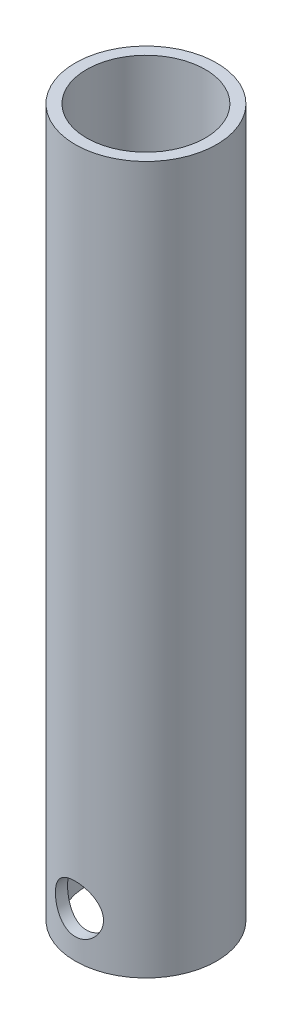
ISO-10303-21;
HEADER;
FILE_DESCRIPTION(('STEP AP214'),'2;1');
FILE_NAME('part.step','',(''),(''),'','','');
FILE_SCHEMA(('AUTOMOTIVE_DESIGN { 1 0 10303 214 1 1 1 1 }'));
ENDSEC;
DATA;
#1=APPLICATION_CONTEXT('core data for automotive mechanical design processes');
#2=APPLICATION_PROTOCOL_DEFINITION('international standard','automotive_design',2000,#1);
#3=PRODUCT_CONTEXT('',#1,'mechanical');
#4=PRODUCT('Part','Part','',(#3));
#5=PRODUCT_RELATED_PRODUCT_CATEGORY('part','',(#4));
#6=PRODUCT_DEFINITION_FORMATION('','',#4);
#7=PRODUCT_DEFINITION_CONTEXT('part definition',#1,'design');
#8=PRODUCT_DEFINITION('design','',#6,#7);
#9=PRODUCT_DEFINITION_SHAPE('','',#8);
#10=(LENGTH_UNIT() NAMED_UNIT(*) SI_UNIT(.MILLI.,.METRE.));
#11=(NAMED_UNIT(*) PLANE_ANGLE_UNIT() SI_UNIT($,.RADIAN.));
#12=(NAMED_UNIT(*) SI_UNIT($,.STERADIAN.) SOLID_ANGLE_UNIT());
#13=UNCERTAINTY_MEASURE_WITH_UNIT(LENGTH_MEASURE(1.E-05),#10,'distance_accuracy_value','');
#14=(GEOMETRIC_REPRESENTATION_CONTEXT(3) GLOBAL_UNCERTAINTY_ASSIGNED_CONTEXT((#13)) GLOBAL_UNIT_ASSIGNED_CONTEXT((#10,
#11,#12)) REPRESENTATION_CONTEXT('',''));
#15=CARTESIAN_POINT('',(0.,0.,0.));
#16=DIRECTION('',(0.,0.,1.));
#17=DIRECTION('',(1.,0.,0.));
#18=AXIS2_PLACEMENT_3D('',#15,#16,#17);
#19=CARTESIAN_POINT('',(0.,125.,0.));
#20=DIRECTION('',(0.,1.,0.));
#21=DIRECTION('',(0.,0.,1.));
#22=AXIS2_PLACEMENT_3D('',#19,#20,#21);
#23=PLANE('',#22);
#24=CARTESIAN_POINT('',(0.,125.,0.));
#25=DIRECTION('',(0.,1.,0.));
#26=DIRECTION('',(0.,0.,1.));
#27=AXIS2_PLACEMENT_3D('',#24,#25,#26);
#28=CIRCLE('',#27,12.5);
#29=CARTESIAN_POINT('',(0.,125.,12.5));
#30=VERTEX_POINT('',#29);
#31=EDGE_CURVE('E10',#30,#30,#28,.T.);
#32=ORIENTED_EDGE('',*,*,#31,.T.);
#33=EDGE_LOOP('',(#32));
#34=FACE_BOUND('',#33,.T.);
#35=CARTESIAN_POINT('',(0.,125.,0.));
#36=DIRECTION('',(0.,1.,0.));
#37=DIRECTION('',(0.,0.,1.));
#38=AXIS2_PLACEMENT_3D('',#35,#36,#37);
#39=CIRCLE('',#38,10.5);
#40=CARTESIAN_POINT('',(0.,125.,10.5));
#41=VERTEX_POINT('',#40);
#42=EDGE_CURVE('E51',#41,#41,#39,.T.);
#43=ORIENTED_EDGE('',*,*,#42,.F.);
#44=EDGE_LOOP('',(#43));
#45=FACE_BOUND('',#44,.T.);
#46=ADVANCED_FACE('F32',(#34,#45),#23,.T.);
#47=CARTESIAN_POINT('',(0.,0.,0.));
#48=DIRECTION('',(0.,1.,0.));
#49=DIRECTION('',(0.,0.,1.));
#50=AXIS2_PLACEMENT_3D('',#47,#48,#49);
#51=PLANE('',#50);
#52=CARTESIAN_POINT('',(0.,0.,0.));
#53=DIRECTION('',(0.,1.,0.));
#54=DIRECTION('',(0.,0.,1.));
#55=AXIS2_PLACEMENT_3D('',#52,#53,#54);
#56=CIRCLE('',#55,12.5);
#57=CARTESIAN_POINT('',(0.,0.,12.5));
#58=VERTEX_POINT('',#57);
#59=EDGE_CURVE('E46',#58,#58,#56,.T.);
#60=ORIENTED_EDGE('',*,*,#59,.F.);
#61=EDGE_LOOP('',(#60));
#62=FACE_BOUND('',#61,.T.);
#63=CARTESIAN_POINT('',(0.,0.,0.));
#64=DIRECTION('',(0.,1.,0.));
#65=DIRECTION('',(0.,0.,1.));
#66=AXIS2_PLACEMENT_3D('',#63,#64,#65);
#67=CIRCLE('',#66,10.5);
#68=CARTESIAN_POINT('',(0.,0.,10.5));
#69=VERTEX_POINT('',#68);
#70=EDGE_CURVE('E54',#69,#69,#67,.T.);
#71=ORIENTED_EDGE('',*,*,#70,.T.);
#72=EDGE_LOOP('',(#71));
#73=FACE_BOUND('',#72,.T.);
#74=ADVANCED_FACE('F103',(#62,#73),#51,.F.);
#75=CARTESIAN_POINT('',(0.,125.,0.));
#76=DIRECTION('',(0.,-1.,0.));
#77=DIRECTION('',(0.,0.,-1.));
#78=AXIS2_PLACEMENT_3D('',#75,#76,#77);
#79=CYLINDRICAL_SURFACE('',#78,12.5);
#80=CARTESIAN_POINT('',(-12.4899959967968,56.,-0.5));
#81=CARTESIAN_POINT('',(-12.4899961315224,56.0280731633728,-0.499998758798746));
#82=CARTESIAN_POINT('',(-12.4900916618139,56.0561663964834,-0.497627754285822));
#83=CARTESIAN_POINT('',(-12.4904635421187,56.111578333317,-0.488202712247755));
#84=CARTESIAN_POINT('',(-12.4907401068309,56.1388960771565,-0.481143114107626));
#85=CARTESIAN_POINT('',(-12.4914426775378,56.1919462896622,-0.462542918883273));
#86=CARTESIAN_POINT('',(-12.4918686090698,56.2176795407324,-0.451004554257527));
#87=CARTESIAN_POINT('',(-12.4928218248314,56.2668367926558,-0.423777660159963));
#88=CARTESIAN_POINT('',(-12.4933490846693,56.2902613472097,-0.408090129134242));
#89=CARTESIAN_POINT('',(-12.4944459704595,56.3341597593796,-0.372997754449343));
#90=CARTESIAN_POINT('',(-12.4950156218316,56.3546318245942,-0.353590669226714));
#91=CARTESIAN_POINT('',(-12.4961328567103,56.3920289255691,-0.311614354933472));
#92=CARTESIAN_POINT('',(-12.4966804393279,56.4089538185401,-0.28904499862844));
#93=CARTESIAN_POINT('',(-12.4976919893825,56.43878028225,-0.241376432340122));
#94=CARTESIAN_POINT('',(-12.4981559302703,56.4516805764639,-0.216276423015974));
#95=CARTESIAN_POINT('',(-12.4989476710099,56.4730834220647,-0.164264700944852));
#96=CARTESIAN_POINT('',(-12.4992754716193,56.4815859979237,-0.137352998280412));
#97=CARTESIAN_POINT('',(-12.4997578274104,56.4939476435077,-0.0824972113326908));
#98=CARTESIAN_POINT('',(-12.4999124760636,56.4978092186378,-0.0545536924725181));
#99=CARTESIAN_POINT('',(-12.5000314109699,56.5007869734338,0.00158535117207156));
#100=CARTESIAN_POINT('',(-12.4999956983058,56.4999031800914,0.0297808745221726));
#101=CARTESIAN_POINT('',(-12.4997380149168,56.4934173785891,0.0856065942701087));
#102=CARTESIAN_POINT('',(-12.4995161507575,56.4878180698984,0.113237104850637));
#103=CARTESIAN_POINT('',(-12.4989112854575,56.4720643622813,0.167165670443885));
#104=CARTESIAN_POINT('',(-12.4985282838213,56.4619099493462,0.193463721358534));
#105=CARTESIAN_POINT('',(-12.4976441157177,56.437331190201,0.243989559590985));
#106=CARTESIAN_POINT('',(-12.4971429151084,56.4229056099518,0.268216745977472));
#107=CARTESIAN_POINT('',(-12.4960788152025,56.3901949127874,0.313906557044649));
#108=CARTESIAN_POINT('',(-12.4955159156358,56.3719097789825,0.335369169626786));
#109=CARTESIAN_POINT('',(-12.4943913691821,56.3319837517768,0.374936326435153));
#110=CARTESIAN_POINT('',(-12.4938297234487,56.3103405165538,0.39303850771634));
#111=CARTESIAN_POINT('',(-12.492771400904,56.2643209026412,0.425352751577672));
#112=CARTESIAN_POINT('',(-12.4922747241059,56.2399445233982,0.439564813370343));
#113=CARTESIAN_POINT('',(-12.4914023756991,56.1891492044641,0.463695156244902));
#114=CARTESIAN_POINT('',(-12.491026706401,56.1627302257815,0.47361335533723));
#115=CARTESIAN_POINT('',(-12.490438827807,56.1086002658312,0.488872885770282));
#116=CARTESIAN_POINT('',(-12.4902266177232,56.0808892907914,0.494214239170918));
#117=CARTESIAN_POINT('',(-12.4899897312153,56.024982520474,0.500165547407391));
#118=CARTESIAN_POINT('',(-12.4899649249297,55.9967870744922,0.500778778601814));
#119=CARTESIAN_POINT('',(-12.490105304363,55.9406936552421,0.497264978377538));
#120=CARTESIAN_POINT('',(-12.4902704896835,55.91279568135,0.493137956901042));
#121=CARTESIAN_POINT('',(-12.4907721140578,55.858098295749,0.480263517491171));
#122=CARTESIAN_POINT('',(-12.4911084977489,55.8312985319235,0.471517593196318));
#123=CARTESIAN_POINT('',(-12.4919145543835,55.7795474852272,0.449655125479497));
#124=CARTESIAN_POINT('',(-12.4923842278159,55.7545962091386,0.4365385660223));
#125=CARTESIAN_POINT('',(-12.4934042386814,55.7072353286888,0.406298729404587));
#126=CARTESIAN_POINT('',(-12.4939546204274,55.6848271326692,0.389173248050535));
#127=CARTESIAN_POINT('',(-12.4950738514507,55.6432026539284,0.351404926283493));
#128=CARTESIAN_POINT('',(-12.4956427008063,55.6239863847076,0.33076207099436));
#129=CARTESIAN_POINT('',(-12.4967351243546,55.5892802699084,0.286530925488431));
#130=CARTESIAN_POINT('',(-12.4972586727539,55.5737925384553,0.262940975693575));
#131=CARTESIAN_POINT('',(-12.4982011149901,55.5469975887314,0.213493699311905));
#132=CARTESIAN_POINT('',(-12.4986200091592,55.5356903571848,0.187636379925756));
#133=CARTESIAN_POINT('',(-12.4993058040844,55.5175810839965,0.134396283000124));
#134=CARTESIAN_POINT('',(-12.4995727507864,55.5107776803824,0.10701396934191));
#135=CARTESIAN_POINT('',(-12.4999247446076,55.501864723718,0.0514946355329766));
#136=CARTESIAN_POINT('',(-12.5000097922652,55.4997551567742,0.0233576176163788));
#137=CARTESIAN_POINT('',(-12.4999884051138,55.5002899097484,-0.0328513731026747));
#138=CARTESIAN_POINT('',(-12.4998821041397,55.5029309069794,-0.0609233776279531));
#139=CARTESIAN_POINT('',(-12.4994902558297,55.5128849677852,-0.116225169175835));
#140=CARTESIAN_POINT('',(-12.4992047081453,55.5201980404413,-0.143454954561276));
#141=CARTESIAN_POINT('',(-12.4984865131084,55.5392880611364,-0.19630026155011));
#142=CARTESIAN_POINT('',(-12.4980538637642,55.5510650696124,-0.221915761292292));
#143=CARTESIAN_POINT('',(-12.4970901740698,55.5787478977871,-0.270805791204831));
#144=CARTESIAN_POINT('',(-12.496559137042,55.594653578073,-0.294080400383137));
#145=CARTESIAN_POINT('',(-12.4954580704139,55.6301534802439,-0.337644146779991));
#146=CARTESIAN_POINT('',(-12.4948880179186,55.6497498799467,-0.357931508626451));
#147=CARTESIAN_POINT('',(-12.4937732712101,55.6920761140362,-0.39493433452815));
#148=CARTESIAN_POINT('',(-12.4932285832932,55.7148067209179,-0.411648915393999));
#149=CARTESIAN_POINT('',(-12.4922257291581,55.7627689311172,-0.441036725205956));
#150=CARTESIAN_POINT('',(-12.4917676310666,55.78800248008,-0.453706777379506));
#151=CARTESIAN_POINT('',(-12.4909907754811,55.8402212443404,-0.474615582615988));
#152=CARTESIAN_POINT('',(-12.4906718525999,55.867204336529,-0.482859598009789));
#153=CARTESIAN_POINT('',(-12.4902942095784,55.9119638886124,-0.492507314414765));
#154=CARTESIAN_POINT('',(-12.4901828688378,55.9294500810227,-0.495313513479018));
#155=CARTESIAN_POINT('',(-12.490033720011,55.9646215249919,-0.499060246908735));
#156=CARTESIAN_POINT('',(-12.4899959118854,55.9823067764443,-0.500000782272058));
#157=CARTESIAN_POINT('',(-12.4899959967968,56.,-0.5));
#158=B_SPLINE_CURVE_WITH_KNOTS('',3,(#80,#81,#82,#83,#84,#85,#86,#87,#88,#89,#90,#91,#92,#93,
#94,#95,#96,#97,#98,#99,#100,#101,#102,#103,#104,#105,#106,#107,#108,#109,#110,#111,#112,#113,
#114,#115,#116,#117,#118,#119,#120,#121,#122,#123,#124,#125,#126,#127,#128,#129,#130,#131,#132,
#133,#134,#135,#136,#137,#138,#139,#140,#141,#142,#143,#144,#145,#146,#147,#148,#149,#150,#151,
#152,#153,#154,#155,#156,#157),.UNSPECIFIED.,.T.,.F.,(4,2,2,2,2,2,2,2,2,2,2,2,2,2,2,2,2,2,2,2,2,
2,2,2,2,2,2,2,2,2,2,2,2,2,2,2,2,2,4),(0.,0.0841549055975104,0.168409796543891,0.252622744132724,
0.336815445315113,0.42105904509454,0.505306035400837,0.589579720121223,0.673852935875886,
0.758080636981668,0.842307858999569,0.92648689659987,1.01066619308291,1.09486983468678,
1.17907384477696,1.26333684192478,1.34759985612988,1.43186447923196,1.51612869618518,
1.60033451688446,1.68454016097082,1.76871859170033,1.85289733127175,1.93712246332911,
2.02134795161137,2.10562108485664,2.18989395047879,2.27414132005546,2.35838844026539,
2.44257665842244,2.52676504021994,2.6109545618805,2.69514124108647,2.77937775365914,
2.86363506542886,2.94795839513712,3.03218124544945,3.08522023983212,3.13825920584661),.UNSPECIFIED.);
#159=CARTESIAN_POINT('',(-12.4899959967968,56.,-0.5));
#160=VERTEX_POINT('',#159);
#161=EDGE_CURVE('E64',#160,#160,#158,.T.);
#162=ORIENTED_EDGE('',*,*,#161,.T.);
#163=EDGE_LOOP('',(#162));
#164=FACE_BOUND('',#163,.T.);
#165=CARTESIAN_POINT('',(0.,12.25,-12.5));
#166=CARTESIAN_POINT('',(-0.231629316585797,12.2500020330341,-12.5000013493631));
#167=CARTESIAN_POINT('',(-0.463244602260156,12.2310026670462,-12.493502868787));
#168=CARTESIAN_POINT('',(-0.919637198733393,12.1557510509299,-12.4682205879803));
#169=CARTESIAN_POINT('',(-1.14441406994913,12.0994964112488,-12.4494359997198));
#170=CARTESIAN_POINT('',(-1.58048439723264,11.9518965380055,-12.4016188733298));
#171=CARTESIAN_POINT('',(-1.79180021823001,11.860611378287,-12.3726038861914));
#172=CARTESIAN_POINT('',(-2.1961203899874,11.6458184811844,-12.3072763657775));
#173=CARTESIAN_POINT('',(-2.38912089291743,11.5223039931499,-12.270962304028));
#174=CARTESIAN_POINT('',(-2.75825261944734,11.2419106918981,-12.1933910285169));
#175=CARTESIAN_POINT('',(-2.93363688121842,11.0840824421219,-12.1520119725704));
#176=CARTESIAN_POINT('',(-3.25602333800846,10.7415597009182,-12.069633438027));
#177=CARTESIAN_POINT('',(-3.40301894005995,10.5568589860642,-12.0286340497037));
#178=CARTESIAN_POINT('',(-3.66879190776174,10.1590227206061,-11.9503048632061));
#179=CARTESIAN_POINT('',(-3.78658554363524,9.94519807052359,-11.9131228611846));
#180=CARTESIAN_POINT('',(-3.98421855180598,9.49930533937396,-11.8484975327096));
#181=CARTESIAN_POINT('',(-4.06407004270031,9.26724311096489,-11.8210510974587));
#182=CARTESIAN_POINT('',(-4.180727158555,8.79997546727208,-11.7802904138908));
#183=CARTESIAN_POINT('',(-4.21893677153849,8.56516186015111,-11.7665167255043));
#184=CARTESIAN_POINT('',(-4.2556150496915,8.09208349333586,-11.7533040945085));
#185=CARTESIAN_POINT('',(-4.25409658909983,7.85381987666286,-11.7538605081001));
#186=CARTESIAN_POINT('',(-4.21244934024964,7.39270505417056,-11.7688435667819));
#187=CARTESIAN_POINT('',(-4.1741694203804,7.16966149615458,-11.7826060062583));
#188=CARTESIAN_POINT('',(-4.06310816523945,6.73337451247597,-11.8213609901718));
#189=CARTESIAN_POINT('',(-3.99032254229152,6.52013230834213,-11.8463549302143));
#190=CARTESIAN_POINT('',(-3.81113653039608,6.10536762878388,-11.9052184288415));
#191=CARTESIAN_POINT('',(-3.70419900732798,5.90409797144144,-11.9392282253861));
#192=CARTESIAN_POINT('',(-3.46011773998614,5.52178292612745,-12.0122344758094));
#193=CARTESIAN_POINT('',(-3.3229649914025,5.34074359119888,-12.0512324147271));
#194=CARTESIAN_POINT('',(-3.01353124215082,4.99366148971603,-12.1324166416207));
#195=CARTESIAN_POINT('',(-2.83974395035441,4.82897235645759,-12.1746609041245));
#196=CARTESIAN_POINT('',(-2.46650176991709,4.53071467225496,-12.2557250188891));
#197=CARTESIAN_POINT('',(-2.26704421977735,4.39714935227699,-12.294544515365));
#198=CARTESIAN_POINT('',(-1.84516436753421,4.16378172002493,-12.3649312356261));
#199=CARTESIAN_POINT('',(-1.62251944687187,4.06435543822436,-12.3964165316577));
#200=CARTESIAN_POINT('',(-1.16233553494295,3.90479262891258,-12.4479909440337));
#201=CARTESIAN_POINT('',(-0.924801969927404,3.84464187741783,-12.4680841857644));
#202=CARTESIAN_POINT('',(-0.453032806948609,3.76776665202227,-12.4939206883818));
#203=CARTESIAN_POINT('',(-0.219127772365223,3.74921408351853,-12.5002675966187));
#204=CARTESIAN_POINT('',(0.248508234272232,3.7508366933351,-12.499715139365));
#205=CARTESIAN_POINT('',(0.482239229767979,3.77100503411456,-12.4928181125577));
#206=CARTESIAN_POINT('',(0.935487055917021,3.84805823396341,-12.4669514589193));
#207=CARTESIAN_POINT('',(1.15521999196989,3.9038095457653,-12.4483547937561));
#208=CARTESIAN_POINT('',(1.58211571473706,4.04901745782596,-12.4013331971436));
#209=CARTESIAN_POINT('',(1.78927688332144,4.13847838625904,-12.3729070036624));
#210=CARTESIAN_POINT('',(2.19135854363443,4.3512234537794,-12.3081499547371));
#211=CARTESIAN_POINT('',(2.3858005114391,4.47535189063502,-12.2716272117682));
#212=CARTESIAN_POINT('',(2.75168306551547,4.75292288478746,-12.1948041286534));
#213=CARTESIAN_POINT('',(2.92311635003781,4.90637471052051,-12.1545025961777));
#214=CARTESIAN_POINT('',(3.24657351287904,5.2468275664985,-12.0722386132383));
#215=CARTESIAN_POINT('',(3.39729328842666,5.435073487899,-12.0302879182072));
#216=CARTESIAN_POINT('',(3.66518020873975,5.83507787799934,-11.9514023496921));
#217=CARTESIAN_POINT('',(3.78234674334563,6.0468367741812,-11.914467567428));
#218=CARTESIAN_POINT('',(3.97933669538634,6.48815668029807,-11.8501336294714));
#219=CARTESIAN_POINT('',(4.05920753889126,6.71769464628497,-11.8227223748612));
#220=CARTESIAN_POINT('',(4.17877629044749,7.18811756728479,-11.7809981443993));
#221=CARTESIAN_POINT('',(4.21849327320324,7.42899707763657,-11.7666789496003));
#222=CARTESIAN_POINT('',(4.2551029021973,7.90142527017271,-11.7534862510052));
#223=CARTESIAN_POINT('',(4.2541688433069,8.13278545064399,-11.7538288765012));
#224=CARTESIAN_POINT('',(4.21488538095235,8.59186656764045,-11.7679720866019));
#225=CARTESIAN_POINT('',(4.17653837981658,8.81958773687654,-11.781771807111));
#226=CARTESIAN_POINT('',(4.06508169516974,9.26024866991023,-11.8206793925214));
#227=CARTESIAN_POINT('',(3.99270334550051,9.47339613866282,-11.8455487968498));
#228=CARTESIAN_POINT('',(3.81583792726954,9.88468116899619,-11.9036971533386));
#229=CARTESIAN_POINT('',(3.71134355482286,10.0828153034268,-11.9369780181425));
#230=CARTESIAN_POINT('',(3.46772073523882,10.4681337048613,-12.0100690469571));
#231=CARTESIAN_POINT('',(3.32724348872325,10.6544218744554,-12.0501058971147));
#232=CARTESIAN_POINT('',(3.01789256015419,11.0014819910172,-12.1312763731794));
#233=CARTESIAN_POINT('',(2.84901069833453,11.162246561876,-12.1724103121393));
#234=CARTESIAN_POINT('',(2.4793015879225,11.4603796450803,-12.2531734329683));
#235=CARTESIAN_POINT('',(2.2774454476222,11.5965125530158,-12.2926709568964));
#236=CARTESIAN_POINT('',(1.85239769842135,11.8327805226005,-12.3638575017702));
#237=CARTESIAN_POINT('',(1.62921053671336,11.9329230670564,-12.3955481454238));
#238=CARTESIAN_POINT('',(1.1749855410373,12.0911995465962,-12.4466848305204));
#239=CARTESIAN_POINT('',(0.944413374480445,12.1505523489214,-12.4664836857426));
#240=CARTESIAN_POINT('',(0.475887689244039,12.2299455427374,-12.4931386057906));
#241=CARTESIAN_POINT('',(0.237936441911583,12.2499979116076,-12.4999986138946));
#242=CARTESIAN_POINT('',(0.,12.25,-12.5));
#243=B_SPLINE_CURVE_WITH_KNOTS('',3,(#165,#166,#167,#168,#169,#170,#171,#172,#173,#174,#175,
#176,#177,#178,#179,#180,#181,#182,#183,#184,#185,#186,#187,#188,#189,#190,#191,#192,#193,#194,
#195,#196,#197,#198,#199,#200,#201,#202,#203,#204,#205,#206,#207,#208,#209,#210,#211,#212,#213,
#214,#215,#216,#217,#218,#219,#220,#221,#222,#223,#224,#225,#226,#227,#228,#229,#230,#231,#232,
#233,#234,#235,#236,#237,#238,#239,#240,#241,#242),.UNSPECIFIED.,.T.,.F.,(4,2,2,2,2,2,2,2,2,2,2,
2,2,2,2,2,2,2,2,2,2,2,2,2,2,2,2,2,2,2,2,2,2,2,2,2,2,2,4),(0.,0.694012031135521,1.38806858050573,
2.08094017307814,2.77395700894338,3.48937549744916,4.20495993509719,4.94210626785764,
5.67901699996315,6.39023024980915,7.10121302747361,7.77821403353031,8.45529918574264,
9.14360628251112,9.83211877686468,10.5581272082641,11.2842109731308,12.0180534127162,
12.7516299370932,13.4522781499046,14.1528026499667,14.8320547208526,15.5113940346079,
16.2089885679879,16.9068039604598,17.6376748123878,18.368558954226,19.0985111385898,
19.8281164030437,20.5187658396099,21.2093709316938,21.8857695188883,22.5623220478608,
23.2693695244284,23.976620961389,24.7129879656022,25.4492017820333,26.1623287080454,
26.8752382644273),.UNSPECIFIED.);
#244=CARTESIAN_POINT('',(0.,12.25,-12.5));
#245=VERTEX_POINT('',#244);
#246=EDGE_CURVE('E89',#245,#245,#243,.T.);
#247=ORIENTED_EDGE('',*,*,#246,.T.);
#248=EDGE_LOOP('',(#247));
#249=FACE_BOUND('',#248,.T.);
#250=CARTESIAN_POINT('',(4.25,8.,11.7553179455087));
#251=CARTESIAN_POINT('',(4.25000208635938,7.76880822439578,11.7553163048564));
#252=CARTESIAN_POINT('',(4.23107177309128,7.53763061110169,11.7622127031611));
#253=CARTESIAN_POINT('',(4.15611937649357,7.08214309436849,11.7889024426549));
#254=CARTESIAN_POINT('',(4.10009241001671,6.85783409913431,11.8086974817267));
#255=CARTESIAN_POINT('',(3.95315727615972,6.42275978860879,11.8586887228588));
#256=CARTESIAN_POINT('',(3.86231972243053,6.21196805734828,11.8888638561852));
#257=CARTESIAN_POINT('',(3.64858465717113,5.80854511457881,11.9561841704273));
#258=CARTESIAN_POINT('',(3.52567963418154,5.6159181723876,11.9933309838111));
#259=CARTESIAN_POINT('',(3.24593667986677,5.24644783865442,12.0721055733369));
#260=CARTESIAN_POINT('',(3.08801191357713,5.07045163008639,12.1138482614208));
#261=CARTESIAN_POINT('',(2.74502977872382,4.74686087824586,12.1961419607755));
#262=CARTESIAN_POINT('',(2.55996786105974,4.59927110646021,12.2366927708767));
#263=CARTESIAN_POINT('',(2.16173358215593,4.33280306385099,12.3133695834904));
#264=CARTESIAN_POINT('',(1.9479322684075,4.2148175164114,12.3493447648353));
#265=CARTESIAN_POINT('',(1.50208314069309,4.01682398888647,12.4114588114545));
#266=CARTESIAN_POINT('',(1.27004047751297,3.93680533272072,12.4376004414402));
#267=CARTESIAN_POINT('',(0.803181808925198,3.819904815012,12.4762877361144));
#268=CARTESIAN_POINT('',(0.568768024092831,3.78157056541103,12.4892899687544));
#269=CARTESIAN_POINT('',(0.096498681332753,3.74450353045823,12.5018568685094));
#270=CARTESIAN_POINT('',(-0.141355937364764,3.74576013468428,12.5014251359524));
#271=CARTESIAN_POINT('',(-0.603455244429958,3.78692937785992,12.4874792686763));
#272=CARTESIAN_POINT('',(-0.827859366125013,3.82526336393966,12.474499409838));
#273=CARTESIAN_POINT('',(-1.26683563867679,3.93688176729382,12.4375910854643));
#274=CARTESIAN_POINT('',(-1.48140711554011,4.01016857654574,12.4136618706201));
#275=CARTESIAN_POINT('',(-1.89801640335549,4.19050413003855,12.3568751775078));
#276=CARTESIAN_POINT('',(-2.09984758406958,4.2979923868106,12.3239022889639));
#277=CARTESIAN_POINT('',(-2.48306659203639,4.54331376073188,12.2524460502634));
#278=CARTESIAN_POINT('',(-2.66444855405648,4.68115555055399,12.2139611262977));
#279=CARTESIAN_POINT('',(-3.01099992399037,4.99117453014917,12.1333048225972));
#280=CARTESIAN_POINT('',(-3.17494418986543,5.16470026780617,12.0910451976412));
#281=CARTESIAN_POINT('',(-3.47181232675949,5.53712761234405,12.0091752957356));
#282=CARTESIAN_POINT('',(-3.60473100646118,5.73603345732031,11.969565462949));
#283=CARTESIAN_POINT('',(-3.83756473071074,6.15759992871054,11.8969851778806));
#284=CARTESIAN_POINT('',(-3.93694148373781,6.38057849899919,11.8641260508176));
#285=CARTESIAN_POINT('',(-4.09631339640205,6.84150572085196,11.8100543141711));
#286=CARTESIAN_POINT('',(-4.15632586418345,7.07944774261142,11.7888365866345));
#287=CARTESIAN_POINT('',(-4.23272709729825,7.55164009628404,11.7616154920121));
#288=CARTESIAN_POINT('',(-4.25102291540232,7.78554356028312,11.7549476419358));
#289=CARTESIAN_POINT('',(-4.2488891326801,8.25312404522198,11.7557200468072));
#290=CARTESIAN_POINT('',(-4.22846693505826,8.48680110090525,11.7631576046845));
#291=CARTESIAN_POINT('',(-4.15119312232908,8.93845888046283,11.790638359865));
#292=CARTESIAN_POINT('',(-4.09568855042672,9.15670154188792,11.8102149538794));
#293=CARTESIAN_POINT('',(-3.9514537893724,9.58072428752929,11.8592485003546));
#294=CARTESIAN_POINT('',(-3.86271756175014,9.78650209887829,11.888707248384));
#295=CARTESIAN_POINT('',(-3.65124748009679,10.1872093806727,11.9553766913527));
#296=CARTESIAN_POINT('',(-3.52749746510955,10.3815646574045,11.9928092351957));
#297=CARTESIAN_POINT('',(-3.25065304738288,10.7474387202912,12.0707872460142));
#298=CARTESIAN_POINT('',(-3.09754966045709,10.9189504874256,12.1113336637695));
#299=CARTESIAN_POINT('',(-2.75718975144257,11.2432047947156,12.1934414759765));
#300=CARTESIAN_POINT('',(-2.56860120561712,11.3945664440502,12.2349510943746));
#301=CARTESIAN_POINT('',(-2.16767839127811,11.6635958933644,12.3123024299383));
#302=CARTESIAN_POINT('',(-1.9553448608948,11.7812647403048,12.3481443232058));
#303=CARTESIAN_POINT('',(-1.51390748124952,11.9785220351902,12.4099713333259));
#304=CARTESIAN_POINT('',(-1.28491760269165,12.0583455126643,12.4360170721838));
#305=CARTESIAN_POINT('',(-0.815699002397318,12.1780013666957,12.4755748071516));
#306=CARTESIAN_POINT('',(-0.575474556193984,12.2178488293486,12.489091531298));
#307=CARTESIAN_POINT('',(-0.103211830111088,12.2550209742181,12.50169717107));
#308=CARTESIAN_POINT('',(0.128654421017075,12.2543244388139,12.501457487594));
#309=CARTESIAN_POINT('',(0.588812496753036,12.2153415064129,12.4882452162174));
#310=CARTESIAN_POINT('',(0.81710462958583,12.177058369155,12.4752737324961));
#311=CARTESIAN_POINT('',(1.25973733436524,12.0653164091026,12.438311718123));
#312=CARTESIAN_POINT('',(1.47424962273104,11.992469689247,12.4145132190251));
#313=CARTESIAN_POINT('',(1.88808156366101,11.8142408217572,12.3583495347409));
#314=CARTESIAN_POINT('',(2.08739842506849,11.7088527146591,12.3259827805629));
#315=CARTESIAN_POINT('',(2.47341490547125,11.4639468867196,12.2544776933187));
#316=CARTESIAN_POINT('',(2.65935109194141,11.3232880355071,12.2151293747917));
#317=CARTESIAN_POINT('',(3.0056225058322,11.0137518219909,12.1345744052391));
#318=CARTESIAN_POINT('',(3.16594936631593,10.8448652740194,12.0933671524889));
#319=CARTESIAN_POINT('',(3.46317770167239,10.4753569274188,12.0117094140378));
#320=CARTESIAN_POINT('',(3.59884229876753,10.2737145025818,11.9713600094017));
#321=CARTESIAN_POINT('',(3.83428262236865,9.84922788369567,11.8980483180312));
#322=CARTESIAN_POINT('',(3.93406590564969,9.62638816641279,11.865084476414));
#323=CARTESIAN_POINT('',(4.0917578844551,9.17293560548369,11.8116162303556));
#324=CARTESIAN_POINT('',(4.15089676108841,8.94279496688636,11.7907491035731));
#325=CARTESIAN_POINT('',(4.23000923378121,8.47509598091428,11.7626034107323));
#326=CARTESIAN_POINT('',(4.24999785634726,8.23754051505206,11.7553196312149));
#327=CARTESIAN_POINT('',(4.25,8.,11.7553179455087));
#328=B_SPLINE_CURVE_WITH_KNOTS('',3,(#250,#251,#252,#253,#254,#255,#256,#257,#258,#259,#260,
#261,#262,#263,#264,#265,#266,#267,#268,#269,#270,#271,#272,#273,#274,#275,#276,#277,#278,#279,
#280,#281,#282,#283,#284,#285,#286,#287,#288,#289,#290,#291,#292,#293,#294,#295,#296,#297,#298,
#299,#300,#301,#302,#303,#304,#305,#306,#307,#308,#309,#310,#311,#312,#313,#314,#315,#316,#317,
#318,#319,#320,#321,#322,#323,#324,#325,#326,#327),.UNSPECIFIED.,.T.,.F.,(4,2,2,2,2,2,2,2,2,2,2,
2,2,2,2,2,2,2,2,2,2,2,2,2,2,2,2,2,2,2,2,2,2,2,2,2,2,2,4),(0.,0.692694920384617,1.38548104047712,
2.07686921235574,2.76841948009047,3.48554525708903,4.20279138623515,4.93959691860359,
5.67619514235265,6.38621339082408,7.09604135470939,7.77691942027095,8.45784408804076,
9.14789875658826,9.83815084536889,10.5621283168264,11.2862268402086,12.0214474433795,
12.7563445591683,13.456908323454,14.1573381476704,14.8323840278356,15.5075526290563,
16.2047830406201,16.9022271951569,17.6348081128836,18.3673662641226,19.0953134364971,
19.8229857936747,20.515174766614,21.2073037140138,21.8876085563469,22.568038060209,
23.2742297793021,23.9806517515895,24.7161707244756,25.4515347027242,26.1635249917672,
26.8752419537226),.UNSPECIFIED.);
#329=CARTESIAN_POINT('',(4.25,8.,11.7553179455087));
#330=VERTEX_POINT('',#329);
#331=EDGE_CURVE('E83',#330,#330,#328,.T.);
#332=ORIENTED_EDGE('',*,*,#331,.T.);
#333=EDGE_LOOP('',(#332));
#334=FACE_BOUND('',#333,.T.);
#335=ORIENTED_EDGE('',*,*,#31,.F.);
#336=EDGE_LOOP('',(#335));
#337=FACE_BOUND('',#336,.T.);
#338=ORIENTED_EDGE('',*,*,#59,.T.);
#339=EDGE_LOOP('',(#338));
#340=FACE_BOUND('',#339,.T.);
#341=ADVANCED_FACE('F34',(#164,#249,#334,#337,#340),#79,.T.);
#342=CARTESIAN_POINT('',(0.,125.,0.));
#343=DIRECTION('',(0.,-1.,0.));
#344=DIRECTION('',(0.,0.,-1.));
#345=AXIS2_PLACEMENT_3D('',#342,#343,#344);
#346=CYLINDRICAL_SURFACE('',#345,10.5);
#347=CARTESIAN_POINT('',(-10.4880884817015,56.,-0.5));
#348=CARTESIAN_POINT('',(-10.4880886418168,56.0280681316031,-0.499998760661433));
#349=CARTESIAN_POINT('',(-10.4882023661847,56.0561562099475,-0.497628602575389));
#350=CARTESIAN_POINT('',(-10.4886450598663,56.1115576338928,-0.488207118868973));
#351=CARTESIAN_POINT('',(-10.4889742832942,56.13887002509,-0.481150266604977));
#352=CARTESIAN_POINT('',(-10.4898105980399,56.191909504748,-0.4625577937577));
#353=CARTESIAN_POINT('',(-10.4903175992042,56.2176373889745,-0.451024442953018));
#354=CARTESIAN_POINT('',(-10.4914522265856,56.2667849699971,-0.423809814554239));
#355=CARTESIAN_POINT('',(-10.4920798241787,56.2902052125272,-0.408129520917576));
#356=CARTESIAN_POINT('',(-10.4933855958008,56.3341015188939,-0.373049783436998));
#357=CARTESIAN_POINT('',(-10.4940638105437,56.354575173017,-0.353647325524974));
#358=CARTESIAN_POINT('',(-10.4953940090744,56.3919766074015,-0.311679991783229));
#359=CARTESIAN_POINT('',(-10.4960459917945,56.4089042434425,-0.289114987391565));
#360=CARTESIAN_POINT('',(-10.4972505565079,56.4387395294913,-0.241450780784619));
#361=CARTESIAN_POINT('',(-10.4978030929216,56.4516453381308,-0.216350424718026));
#362=CARTESIAN_POINT('',(-10.4987460932963,56.4730587924448,-0.164336153580602));
#363=CARTESIAN_POINT('',(-10.4991365584001,56.4815664691275,-0.137422251297343));
#364=CARTESIAN_POINT('',(-10.4997111445915,56.4939358900889,-0.0825667203082614));
#365=CARTESIAN_POINT('',(-10.4998954234781,56.4978011874521,-0.0546258944694464));
#366=CARTESIAN_POINT('',(-10.5000373990613,56.5007870916517,0.00150858244584018));
#367=CARTESIAN_POINT('',(-10.4999950974133,56.4999077331546,0.0297022316735788));
#368=CARTESIAN_POINT('',(-10.4996888121692,56.4934322402437,0.0855179825005012));
#369=CARTESIAN_POINT('',(-10.499425008352,56.4878399310122,0.113140529003074));
#370=CARTESIAN_POINT('',(-10.4987056425946,56.4721032100767,0.167054342249818));
#371=CARTESIAN_POINT('',(-10.4982500799054,56.4619587805952,0.193345603794404));
#372=CARTESIAN_POINT('',(-10.4971982069147,56.4374014164063,0.243862854706495));
#373=CARTESIAN_POINT('',(-10.4966018391159,56.422986737345,0.268087994865942));
#374=CARTESIAN_POINT('',(-10.4953355232872,56.3902993295786,0.313776055706061));
#375=CARTESIAN_POINT('',(-10.4946655747887,56.3720265763034,0.335238958794112));
#376=CARTESIAN_POINT('',(-10.493326766707,56.3321200882274,0.374815599387355));
#377=CARTESIAN_POINT('',(-10.492657908865,56.3104830348549,0.392925990890224));
#378=CARTESIAN_POINT('',(-10.4913973562923,56.2644738073421,0.42525774740509));
#379=CARTESIAN_POINT('',(-10.4908056615807,56.240101632524,0.439479111453473));
#380=CARTESIAN_POINT('',(-10.4897662101838,56.1893119981773,0.463628818845079));
#381=CARTESIAN_POINT('',(-10.4893184576332,56.1628944799257,0.473557038875928));
#382=CARTESIAN_POINT('',(-10.4886175431107,56.1087649578921,0.488836409691078));
#383=CARTESIAN_POINT('',(-10.4883643798112,56.081052962943,0.494187591701945));
#384=CARTESIAN_POINT('',(-10.4880814374807,56.0251502710814,0.50015685256183));
#385=CARTESIAN_POINT('',(-10.4880514393226,55.9969600709961,0.500779574322352));
#386=CARTESIAN_POINT('',(-10.4882176381039,55.9408755715159,0.497286351685609));
#387=CARTESIAN_POINT('',(-10.488413834366,55.9129812712351,0.493170421477281));
#388=CARTESIAN_POINT('',(-10.4890101082581,55.8582934168203,0.480320580964128));
#389=CARTESIAN_POINT('',(-10.4894100921586,55.8314993627589,0.471588793593155));
#390=CARTESIAN_POINT('',(-10.4903687786354,55.7797571917575,0.449757250840562));
#391=CARTESIAN_POINT('',(-10.4909274820435,55.7548090844932,0.436657472565263));
#392=CARTESIAN_POINT('',(-10.4921411684907,55.7074456275445,0.406449878698394));
#393=CARTESIAN_POINT('',(-10.4927962263291,55.6850322696945,0.389338943093966));
#394=CARTESIAN_POINT('',(-10.4941285246177,55.6433945762234,0.351599312576747));
#395=CARTESIAN_POINT('',(-10.4948057651973,55.624170259207,0.330970597142845));
#396=CARTESIAN_POINT('',(-10.4961067355828,55.5894407676476,0.286761046380671));
#397=CARTESIAN_POINT('',(-10.4967304219926,55.5739385913027,0.263177854322722));
#398=CARTESIAN_POINT('',(-10.4978533718814,55.5471139257827,0.213740715538109));
#399=CARTESIAN_POINT('',(-10.4983526358643,55.5357914196819,0.187886778007492));
#400=CARTESIAN_POINT('',(-10.4991702644493,55.5176527453511,0.134653221740582));
#401=CARTESIAN_POINT('',(-10.4994887061787,55.5108346556181,0.107274258964214));
#402=CARTESIAN_POINT('',(-10.4999091074728,55.5018920610619,0.0517586434255556));
#403=CARTESIAN_POINT('',(-10.5000110681088,55.4997675330092,0.0236219944139187));
#404=CARTESIAN_POINT('',(-10.4999870210703,55.5002725950076,-0.032580520178207));
#405=CARTESIAN_POINT('',(-10.4998612390137,55.5028974799548,-0.0606464282594962));
#406=CARTESIAN_POINT('',(-10.4993963125418,55.5128171363664,-0.115938631913234));
#407=CARTESIAN_POINT('',(-10.4990571677209,55.5201119167068,-0.143164925889745));
#408=CARTESIAN_POINT('',(-10.4982036779045,55.5391633524479,-0.196006094063663));
#409=CARTESIAN_POINT('',(-10.4976893313017,55.5509200487846,-0.221620953474353));
#410=CARTESIAN_POINT('',(-10.4965432988164,55.5785607227374,-0.270513451796481));
#411=CARTESIAN_POINT('',(-10.4959116166289,55.594444570394,-0.293791164270149));
#412=CARTESIAN_POINT('',(-10.4946013135081,55.6299053352076,-0.337371993511328));
#413=CARTESIAN_POINT('',(-10.4939226516848,55.6494854958082,-0.357672469800975));
#414=CARTESIAN_POINT('',(-10.4925951394087,55.6917816332306,-0.394704433553596));
#415=CARTESIAN_POINT('',(-10.4919462963385,55.7144983810971,-0.411435040879508));
#416=CARTESIAN_POINT('',(-10.4907511966481,55.7624394027585,-0.440859461820445));
#417=CARTESIAN_POINT('',(-10.4902050343345,55.7876659494683,-0.453549571806993));
#418=CARTESIAN_POINT('',(-10.4892784097153,55.8398752228859,-0.474499147195551));
#419=CARTESIAN_POINT('',(-10.4888977515167,55.8668558297221,-0.482763853268613));
#420=CARTESIAN_POINT('',(-10.4884459904769,55.9116704025158,-0.492456899251868));
#421=CARTESIAN_POINT('',(-10.4883125146626,55.9292140024181,-0.495281958254016));
#422=CARTESIAN_POINT('',(-10.4881337096733,55.9645024084699,-0.49905389983693));
#423=CARTESIAN_POINT('',(-10.4880883804303,55.982247214464,-0.500000783868057));
#424=CARTESIAN_POINT('',(-10.4880884817015,56.,-0.5));
#425=B_SPLINE_CURVE_WITH_KNOTS('',3,(#347,#348,#349,#350,#351,#352,#353,#354,#355,#356,#357,
#358,#359,#360,#361,#362,#363,#364,#365,#366,#367,#368,#369,#370,#371,#372,#373,#374,#375,#376,
#377,#378,#379,#380,#381,#382,#383,#384,#385,#386,#387,#388,#389,#390,#391,#392,#393,#394,#395,
#396,#397,#398,#399,#400,#401,#402,#403,#404,#405,#406,#407,#408,#409,#410,#411,#412,#413,#414,
#415,#416,#417,#418,#419,#420,#421,#422,#423,#424),.UNSPECIFIED.,.T.,.F.,(4,2,2,2,2,2,2,2,2,2,2,
2,2,2,2,2,2,2,2,2,2,2,2,2,2,2,2,2,2,2,2,2,2,2,2,2,2,2,4),(0.,0.084139590971339,
0.168378577623298,0.252574907142357,0.336751277043735,0.420996099726276,0.505244348072678,
0.589531112468164,0.673817282607851,0.758038902419375,0.842259906874369,0.926412620617263,
1.01056566300912,1.09475312858081,1.17894113031388,1.2632127088262,1.34748430821911,
1.43175832799222,1.51603177280632,1.60022245816262,1.68441289142757,1.76856463731295,
1.85271682426456,1.93693468608613,2.0211530392128,2.10543900464475,2.18972462875183,
2.27397427487096,2.35822350401903,2.44238931562265,2.52655528719871,2.61072203097917,
2.69488612476126,2.77912441711779,2.86338345415556,2.94771950441603,3.03195545974567,
3.08517286973221,3.1383902386233),.UNSPECIFIED.);
#426=CARTESIAN_POINT('',(-10.4880884817015,56.,-0.5));
#427=VERTEX_POINT('',#426);
#428=EDGE_CURVE('E37',#427,#427,#425,.T.);
#429=ORIENTED_EDGE('',*,*,#428,.F.);
#430=EDGE_LOOP('',(#429));
#431=FACE_BOUND('',#430,.T.);
#432=CARTESIAN_POINT('',(0.,12.25,-10.5));
#433=CARTESIAN_POINT('',(-0.114154109653857,12.2499993059622,-10.4999994552482));
#434=CARTESIAN_POINT('',(-0.228350738906777,12.2453944315658,-10.4981332380661));
#435=CARTESIAN_POINT('',(-0.455934563871733,12.2270168921736,-10.4907150781454));
#436=CARTESIAN_POINT('',(-0.569321177326371,12.2132381947884,-10.4851607102126));
#437=CARTESIAN_POINT('',(-0.794639426617694,12.1766135035081,-10.470497512349));
#438=CARTESIAN_POINT('',(-0.906567459124212,12.1537483061934,-10.4613811551952));
#439=CARTESIAN_POINT('',(-1.12796097838544,12.0991720279705,-10.4398315857659));
#440=CARTESIAN_POINT('',(-1.23742543899726,12.0674573320974,-10.4273970181129));
#441=CARTESIAN_POINT('',(-1.45271387273024,11.9956159468508,-10.3995842967499));
#442=CARTESIAN_POINT('',(-1.55854993876903,11.9555211884311,-10.3842173352802));
#443=CARTESIAN_POINT('',(-1.76636404116427,11.8671987375295,-10.3508965309275));
#444=CARTESIAN_POINT('',(-1.86834062508083,11.8189680197789,-10.3329417261458));
#445=CARTESIAN_POINT('',(-2.16740859038064,11.6626933042946,-10.2758638117787));
#446=CARTESIAN_POINT('',(-2.35793397957099,11.5429672473574,-10.2334871699128));
#447=CARTESIAN_POINT('',(-2.72484108098255,11.2699251675384,-10.142122596323));
#448=CARTESIAN_POINT('',(-2.90023859566173,11.1153681962523,-10.0929264630699));
#449=CARTESIAN_POINT('',(-3.22354831492165,10.7794798760994,-9.99436389375292));
#450=CARTESIAN_POINT('',(-3.37144678898101,10.5981352325607,-9.94499738508195));
#451=CARTESIAN_POINT('',(-3.57283592605324,10.3048485271211,-9.87371516886544));
#452=CARTESIAN_POINT('',(-3.63773156157118,10.2010101069779,-9.84992779172633));
#453=CARTESIAN_POINT('',(-3.75848729994409,9.98777809124599,-9.80448511120572));
#454=CARTESIAN_POINT('',(-3.8143510679261,9.87838677281949,-9.78282894438333));
#455=CARTESIAN_POINT('',(-3.91656436925325,9.65473458154161,-9.74235854601814));
#456=CARTESIAN_POINT('',(-3.96291335399636,9.54047342836441,-9.7235444783612));
#457=CARTESIAN_POINT('',(-4.04561730831726,9.30793606454854,-9.68942635645143));
#458=CARTESIAN_POINT('',(-4.08197732095439,9.18966191393455,-9.67412053166671));
#459=CARTESIAN_POINT('',(-4.14289660193418,8.95544435657027,-9.6481839702914));
#460=CARTESIAN_POINT('',(-4.16791941000741,8.83964163256245,-9.63737147741953));
#461=CARTESIAN_POINT('',(-4.20822774971004,8.60609650533902,-9.6198390880429));
#462=CARTESIAN_POINT('',(-4.22351770730074,8.48835500879487,-9.61311733135907));
#463=CARTESIAN_POINT('',(-4.24419015130937,8.25186362250223,-9.60400845843607));
#464=CARTESIAN_POINT('',(-4.2495748575603,8.13311396468382,-9.60162037099427));
#465=CARTESIAN_POINT('',(-4.25037671321279,7.89557914377899,-9.60126543552392));
#466=CARTESIAN_POINT('',(-4.24579434392104,7.77679398268396,-9.60329837400554));
#467=CARTESIAN_POINT('',(-4.22740411435658,7.54868315303576,-9.61140715421212));
#468=CARTESIAN_POINT('',(-4.21428279725163,7.43929106647677,-9.61718200287533));
#469=CARTESIAN_POINT('',(-4.17964821706433,7.22208197305046,-9.63228349936746));
#470=CARTESIAN_POINT('',(-4.15813219658044,7.1142654958069,-9.64161131421244));
#471=CARTESIAN_POINT('',(-4.08128210123072,6.79433260014175,-9.67451969874221));
#472=CARTESIAN_POINT('',(-4.01363013039594,6.58554060105475,-9.70303279091205));
#473=CARTESIAN_POINT('',(-3.8461587032951,6.17814301534908,-9.77063454299902));
#474=CARTESIAN_POINT('',(-3.74570329030856,5.97983716177694,-9.80992960460528));
#475=CARTESIAN_POINT('',(-3.51590438480498,5.60212549355329,-9.89461438803133));
#476=CARTESIAN_POINT('',(-3.3865498823335,5.4227269206231,-9.94000643003902));
#477=CARTESIAN_POINT('',(-3.09057387805976,5.07298633035358,-10.0361543886286));
#478=CARTESIAN_POINT('',(-2.92181017166279,4.90449148626504,-10.0870501718322));
#479=CARTESIAN_POINT('',(-2.55788887825905,4.59759359249928,-10.1854163360131));
#480=CARTESIAN_POINT('',(-2.36272579490818,4.45919682492373,-10.2328860005087));
#481=CARTESIAN_POINT('',(-1.94620352571022,4.21392450586284,-10.3202924458699));
#482=CARTESIAN_POINT('',(-1.72438630279293,4.10775951858159,-10.36005326851));
#483=CARTESIAN_POINT('',(-1.26402224922069,3.93489077147538,-10.4262262079698));
#484=CARTESIAN_POINT('',(-1.02548420025975,3.86816646873723,-10.4526452728764));
#485=CARTESIAN_POINT('',(-0.553914357092285,3.77984447474018,-10.4878827394457));
#486=CARTESIAN_POINT('',(-0.321419128463548,3.75576627801336,-10.4976671711921));
#487=CARTESIAN_POINT('',(0.14447418656567,3.74607565647668,-10.5015873516466));
#488=CARTESIAN_POINT('',(0.377872015363587,3.76045296432571,-10.4957272773253));
#489=CARTESIAN_POINT('',(0.827597141740798,3.82545435937524,-10.4696477478612));
#490=CARTESIAN_POINT('',(1.04421473035688,3.87437154120092,-10.4501048451961));
#491=CARTESIAN_POINT('',(1.46595780591153,4.00472741005918,-10.3993324098358));
#492=CARTESIAN_POINT('',(1.67108181890243,4.08617025738082,-10.3681013821694));
#493=CARTESIAN_POINT('',(2.0711174728375,4.28192361742184,-10.2957797716462));
#494=CARTESIAN_POINT('',(2.26552109041835,4.3971678446886,-10.2544155260628));
#495=CARTESIAN_POINT('',(2.63292075227945,4.65623100530828,-10.1662913069639));
#496=CARTESIAN_POINT('',(2.80590806008485,4.80006153810531,-10.1195291463799));
#497=CARTESIAN_POINT('',(3.1378168188522,5.12356064774037,-10.0217782709763));
#498=CARTESIAN_POINT('',(3.29499802152631,5.30499411753785,-9.97071747063494));
#499=CARTESIAN_POINT('',(3.57717522083711,5.69268293265247,-9.87300281993801));
#500=CARTESIAN_POINT('',(3.70216537468181,5.8989427740913,-9.82634977057675));
#501=CARTESIAN_POINT('',(3.86314012442907,6.22417308155128,-9.7636830187369));
#502=CARTESIAN_POINT('',(3.9125939106841,6.33593826055967,-9.74391736327695));
#503=CARTESIAN_POINT('',(4.00182953903833,6.56375506444751,-9.70760960655689));
#504=CARTESIAN_POINT('',(4.04161559835516,6.67980479479633,-9.69106610037084));
#505=CARTESIAN_POINT('',(4.11108353550569,6.91530501424237,-9.66180182226704));
#506=CARTESIAN_POINT('',(4.14076957464448,7.03475408074526,-9.64907947624855));
#507=CARTESIAN_POINT('',(4.18971270235437,7.27614407697652,-9.62792923970905));
#508=CARTESIAN_POINT('',(4.20897069392487,7.39808478999565,-9.61950097735276));
#509=CARTESIAN_POINT('',(4.23578720693659,7.63436869971244,-9.60772101567811));
#510=CARTESIAN_POINT('',(4.2441027832176,7.74861018261342,-9.60404120983038));
#511=CARTESIAN_POINT('',(4.25148306942694,7.97749016034492,-9.60077644161389));
#512=CARTESIAN_POINT('',(4.25054467643589,8.09212877545567,-9.60119285273468));
#513=CARTESIAN_POINT('',(4.23941866877054,8.32081481191072,-9.6061110287123));
#514=CARTESIAN_POINT('',(4.22923574816576,8.43486250375215,-9.61061072021208));
#515=CARTESIAN_POINT('',(4.1997531411073,8.66156183086881,-9.6235294035184));
#516=CARTESIAN_POINT('',(4.18045001855654,8.77421292353602,-9.63194987248673));
#517=CARTESIAN_POINT('',(4.11112321526636,9.09944947995247,-9.66184359981798));
#518=CARTESIAN_POINT('',(4.04915072343213,9.30917343995266,-9.68821061853701));
#519=CARTESIAN_POINT('',(3.89460089535219,9.7151959632619,-9.75135753997244));
#520=CARTESIAN_POINT('',(3.80201506337781,9.91149078148164,-9.78814033283805));
#521=CARTESIAN_POINT('',(3.58263235266865,10.2976819158954,-9.87062416412075));
#522=CARTESIAN_POINT('',(3.45416015072663,10.4865436214316,-9.91671922686369));
#523=CARTESIAN_POINT('',(3.16911591171758,10.8409524371132,-10.0114571625779));
#524=CARTESIAN_POINT('',(3.01253503788506,11.0064921860394,-10.0601008333616));
#525=CARTESIAN_POINT('',(2.66306262312627,11.3210513855373,-10.1583983606373));
#526=CARTESIAN_POINT('',(2.46844024026568,11.4682185464051,-10.2079012076128));
#527=CARTESIAN_POINT('',(2.15895606811745,11.6628325015314,-10.2761942453019));
#528=CARTESIAN_POINT('',(2.05277466208585,11.7233868506605,-10.2979805675205));
#529=CARTESIAN_POINT('',(1.83520783560265,11.8352897611069,-10.338966690409));
#530=CARTESIAN_POINT('',(1.72382483364587,11.8866425480363,-10.3581676773243));
#531=CARTESIAN_POINT('',(1.49861237824129,11.9788455378637,-10.3931190838996));
#532=CARTESIAN_POINT('',(1.38486048893054,12.0198646854725,-10.4089242878466));
#533=CARTESIAN_POINT('',(1.15392513007784,12.0921367684765,-10.4370481670463));
#534=CARTESIAN_POINT('',(1.03674330562452,12.1233943044973,-10.4493684844592));
#535=CARTESIAN_POINT('',(0.800113316857352,12.1757597384302,-10.4701429315508));
#536=CARTESIAN_POINT('',(0.68067160568441,12.1968930072833,-10.4786067228714));
#537=CARTESIAN_POINT('',(0.440262158249376,12.2288714991881,-10.4914554497162));
#538=CARTESIAN_POINT('',(0.31929563663131,12.2397244440634,-10.4958434466292));
#539=CARTESIAN_POINT('',(0.165107935165564,12.2469203202441,-10.4987538362676));
#540=CARTESIAN_POINT('',(0.132099683236003,12.2480749284497,-10.4992209317434));
#541=CARTESIAN_POINT('',(0.0660621410070258,12.2496148688665,-10.4998440924765));
#542=CARTESIAN_POINT('',(0.0330328507009512,12.2500002008342,-10.5000001576352));
#543=CARTESIAN_POINT('',(0.,12.25,-10.5));
#544=B_SPLINE_CURVE_WITH_KNOTS('',3,(#432,#433,#434,#435,#436,#437,#438,#439,#440,#441,#442,
#443,#444,#445,#446,#447,#448,#449,#450,#451,#452,#453,#454,#455,#456,#457,#458,#459,#460,#461,
#462,#463,#464,#465,#466,#467,#468,#469,#470,#471,#472,#473,#474,#475,#476,#477,#478,#479,#480,
#481,#482,#483,#484,#485,#486,#487,#488,#489,#490,#491,#492,#493,#494,#495,#496,#497,#498,#499,
#500,#501,#502,#503,#504,#505,#506,#507,#508,#509,#510,#511,#512,#513,#514,#515,#516,#517,#518,
#519,#520,#521,#522,#523,#524,#525,#526,#527,#528,#529,#530,#531,#532,#533,#534,#535,#536,#537,
#538,#539,#540,#541,#542,#543),.UNSPECIFIED.,.T.,.F.,(4,2,2,2,2,2,2,2,2,2,2,2,2,2,2,2,2,2,2,2,2,
2,2,2,2,2,2,2,2,2,2,2,2,2,2,2,2,2,2,2,2,2,2,2,2,2,2,2,2,2,2,2,2,2,2,4),(0.,0.34242846574077,
0.685082323302845,1.02846423031655,1.37198661256101,1.71422316916786,2.05658726438871,
2.74038261720637,3.45411030602066,4.16819341413343,4.54202101309586,4.91569653018147,
5.28939358654958,5.66290162904656,6.01933227990824,6.37560072984178,6.73178932790343,
7.08796072612039,7.41853992960634,7.74922780971989,8.41003197671509,9.08449404399949,
9.75921350687733,10.4874533722192,11.2158450909694,11.9592905307985,12.7023484006921,
13.4005600714175,14.0985853432947,14.764331815698,15.4301634696108,16.1164704779062,
16.8030565391418,17.5360353918367,18.2691471892408,18.6401558117873,19.0110023027119,
19.3816958157745,19.752357224115,20.0957256752096,20.4392092640154,20.7825185405505,
21.1259572644184,21.7836008414284,22.4414270792436,23.1374784926755,23.8337491142346,
24.5767116261921,24.9488076889093,25.320732434422,25.6861110361763,26.0513171750312,
26.4156032739907,26.779615530529,26.8787042522374,26.9777930053175),.UNSPECIFIED.);
#545=CARTESIAN_POINT('',(0.,12.25,-10.5));
#546=VERTEX_POINT('',#545);
#547=EDGE_CURVE('E63',#546,#546,#544,.T.);
#548=ORIENTED_EDGE('',*,*,#547,.F.);
#549=EDGE_LOOP('',(#548));
#550=FACE_BOUND('',#549,.T.);
#551=CARTESIAN_POINT('',(4.25,8.,9.60143218483576));
#552=CARTESIAN_POINT('',(4.24999927319706,7.88627839830782,9.6014329010864));
#553=CARTESIAN_POINT('',(4.24542864252297,7.77251225653655,9.60345969755525));
#554=CARTESIAN_POINT('',(4.22719235362166,7.5458034520026,9.61150044958171));
#555=CARTESIAN_POINT('',(4.21352054331642,7.43286139853759,9.61751710213146));
#556=CARTESIAN_POINT('',(4.17718468439629,7.20843855844248,9.63335471681243));
#557=CARTESIAN_POINT('',(4.15450098076901,7.09696151970893,9.64318399319096));
#558=CARTESIAN_POINT('',(4.10038616625261,6.87650493527203,9.66631724804287));
#559=CARTESIAN_POINT('',(4.06895138693092,6.76752645774182,9.67962268357064));
#560=CARTESIAN_POINT('',(3.96224999873738,6.44638943467846,9.72401961511699));
#561=CARTESIAN_POINT('',(3.87439868889652,6.23888987750461,9.75967884749878));
#562=CARTESIAN_POINT('',(3.66805332909547,5.84174569737904,9.83908176769053));
#563=CARTESIAN_POINT('',(3.54956773330254,5.6520961680067,9.88282322409414));
#564=CARTESIAN_POINT('',(3.27784710906379,5.28464970761321,9.97634236833171));
#565=CARTESIAN_POINT('',(3.12309952700626,5.10801896996072,10.0263173365299));
#566=CARTESIAN_POINT('',(2.78643644907733,4.78236692015423,10.1250445164596));
#567=CARTESIAN_POINT('',(2.60451086229109,4.63335590916408,10.1737962661367));
#568=CARTESIAN_POINT('',(2.20959501947395,4.36132668340591,10.2669582235038));
#569=CARTESIAN_POINT('',(1.9956446161821,4.2396065986696,10.3111124144543));
#570=CARTESIAN_POINT('',(1.54819734805068,4.03438639981098,10.3877084271983));
#571=CARTESIAN_POINT('',(1.31470874669642,3.95087022340966,10.4201551700044));
#572=CARTESIAN_POINT('',(0.847057595451487,3.82861175682159,10.4682844212317));
#573=CARTESIAN_POINT('',(0.613499086274726,3.7878599833753,10.4847164441476));
#574=CARTESIAN_POINT('',(0.142319428951291,3.74581032719148,10.501677682352));
#575=CARTESIAN_POINT('',(-0.095300134104057,3.74449738755284,10.5022129666736));
#576=CARTESIAN_POINT('',(-0.5533067733082,3.78027467985832,10.4877723315348));
#577=CARTESIAN_POINT('',(-0.773899173688628,3.81516139599875,10.4736864049794));
#578=CARTESIAN_POINT('',(-1.20578706807335,3.91859142729016,10.4327920740019));
#579=CARTESIAN_POINT('',(-1.41708187790828,3.98713721476846,10.4059827350241));
#580=CARTESIAN_POINT('',(-1.82820682253523,4.15677514212021,10.3417427377306));
#581=CARTESIAN_POINT('',(-2.02781498052332,4.25834426835742,10.3041574350488));
#582=CARTESIAN_POINT('',(-2.40767181070454,4.49069324706786,10.2220808215444));
#583=CARTESIAN_POINT('',(-2.5879137513008,4.6214832082199,10.1775871224545));
#584=CARTESIAN_POINT('',(-2.93675173389772,4.91877289122458,10.0826747301599));
#585=CARTESIAN_POINT('',(-3.10375726674227,5.0870786235987,10.0320587957795));
#586=CARTESIAN_POINT('',(-3.40783496591249,5.44948229371148,9.9328896551858));
#587=CARTESIAN_POINT('',(-3.54489685311467,5.64358905182197,9.88433716190782));
#588=CARTESIAN_POINT('',(-3.78895814287421,6.05936336199936,9.79343172509393));
#589=CARTESIAN_POINT('',(-3.89495076408117,6.28167531466893,9.75130407788912));
#590=CARTESIAN_POINT('',(-4.06735718597304,6.74315204688927,9.68067091085852));
#591=CARTESIAN_POINT('',(-4.13379742413893,6.98230544949214,9.65215629438356));
#592=CARTESIAN_POINT('',(-4.22129444991624,7.45478797550765,9.6141990080121));
#593=CARTESIAN_POINT('',(-4.24491672474254,7.68755432699749,9.6036805140116));
#594=CARTESIAN_POINT('',(-4.25360474283655,8.15391211005115,9.59983824816477));
#595=CARTESIAN_POINT('',(-4.23868262406728,8.38750325874457,9.60650906325468));
#596=CARTESIAN_POINT('',(-4.17304290742913,8.83440277054132,9.63518754386345));
#597=CARTESIAN_POINT('',(-4.12448588621873,9.04809532528674,9.65626853109987));
#598=CARTESIAN_POINT('',(-3.99577451450377,9.46414889769318,9.71023272915016));
#599=CARTESIAN_POINT('',(-3.91561305109398,9.66650735278157,9.74311859662467));
#600=CARTESIAN_POINT('',(-3.72229722628307,10.0634265305601,9.81863848844207));
#601=CARTESIAN_POINT('',(-3.60792253409606,10.2573251882707,9.86161753944766));
#602=CARTESIAN_POINT('',(-3.35066490261359,10.6240742952995,9.95196519731196));
#603=CARTESIAN_POINT('',(-3.20777014278291,10.7969159692669,9.999335619861));
#604=CARTESIAN_POINT('',(-2.8847176209683,11.1302990625485,10.0974735228328));
#605=CARTESIAN_POINT('',(-2.70255363568153,11.2889083330335,10.1482256670711));
#606=CARTESIAN_POINT('',(-2.31299258690136,11.5736200704403,10.2440350238068));
#607=CARTESIAN_POINT('',(-2.1055942709648,11.6997209229182,10.2890919534098));
#608=CARTESIAN_POINT('',(-1.67052392714368,11.9154567725659,10.3686168087771));
#609=CARTESIAN_POINT('',(-1.44284173381079,12.0050733585846,10.4030793861428));
#610=CARTESIAN_POINT('',(-0.973890689848526,12.1441231956938,10.4573953101035));
#611=CARTESIAN_POINT('',(-0.732629499950956,12.1935788657544,10.4772568068513));
#612=CARTESIAN_POINT('',(-0.260694325222002,12.2481965071999,10.4992435013516));
#613=CARTESIAN_POINT('',(-0.0303848070337406,12.2560881056499,10.5024614516741));
#614=CARTESIAN_POINT('',(0.428172384233099,12.2345988541982,10.4937707115727));
#615=CARTESIAN_POINT('',(0.656420378089974,12.2052239073163,10.4818644168285));
#616=CARTESIAN_POINT('',(1.09686783759694,12.1119890660283,10.4448177706804));
#617=CARTESIAN_POINT('',(1.30934718207972,12.0492640869281,10.4201136080355));
#618=CARTESIAN_POINT('',(1.72071692930209,11.8923170839378,10.3601345016791));
#619=CARTESIAN_POINT('',(1.91960467011816,11.7980889113003,10.3248574945145));
#620=CARTESIAN_POINT('',(2.30789146725406,11.5760802667116,10.2452264319855));
#621=CARTESIAN_POINT('',(2.49647324253625,11.446992214538,10.200538046187));
#622=CARTESIAN_POINT('',(2.85006859591899,11.1609189849909,10.1074527559023));
#623=CARTESIAN_POINT('',(3.01507402871898,11.0039242080648,10.0590545785647));
#624=CARTESIAN_POINT('',(3.32778801399648,10.6545470259183,9.96014132614702));
#625=CARTESIAN_POINT('',(3.47373223635725,10.4605502920667,9.90968704851911));
#626=CARTESIAN_POINT('',(3.66671712354093,10.1523145876904,9.83920217653439));
#627=CARTESIAN_POINT('',(3.72676378361512,10.0465979994109,9.81655615290461));
#628=CARTESIAN_POINT('',(3.83774269172602,9.83002963375695,9.77370269658267));
#629=CARTESIAN_POINT('',(3.88867909167119,9.71918022475927,9.75349415440749));
#630=CARTESIAN_POINT('',(3.98061128103827,9.49395996344651,9.71633556021101));
#631=CARTESIAN_POINT('',(4.02168273031581,9.37962402655576,9.69936092825511));
#632=CARTESIAN_POINT('',(4.09397267083578,9.14745678310077,9.66907053671587));
#633=CARTESIAN_POINT('',(4.12519594466649,9.02962720367069,9.6557530015374));
#634=CARTESIAN_POINT('',(4.17738794714231,8.79166376879818,9.63328794704417));
#635=CARTESIAN_POINT('',(4.19838381967509,8.67153690194123,9.6241293940738));
#636=CARTESIAN_POINT('',(4.2299736744164,8.42973053897705,9.61028741416848));
#637=CARTESIAN_POINT('',(4.24057586828978,8.30805234564071,9.60560045447009));
#638=CARTESIAN_POINT('',(4.24728072466278,8.15515003493601,9.60263537824572));
#639=CARTESIAN_POINT('',(4.24830020221662,8.12413152956638,9.60218443119886));
#640=CARTESIAN_POINT('',(4.24965994044497,8.06207645558643,9.60158273613911));
#641=CARTESIAN_POINT('',(4.25000019837815,8.03103988690372,9.60143198933782));
#642=CARTESIAN_POINT('',(4.25,8.,9.60143218483576));
#643=B_SPLINE_CURVE_WITH_KNOTS('',3,(#551,#552,#553,#554,#555,#556,#557,#558,#559,#560,#561,
#562,#563,#564,#565,#566,#567,#568,#569,#570,#571,#572,#573,#574,#575,#576,#577,#578,#579,#580,
#581,#582,#583,#584,#585,#586,#587,#588,#589,#590,#591,#592,#593,#594,#595,#596,#597,#598,#599,
#600,#601,#602,#603,#604,#605,#606,#607,#608,#609,#610,#611,#612,#613,#614,#615,#616,#617,#618,
#619,#620,#621,#622,#623,#624,#625,#626,#627,#628,#629,#630,#631,#632,#633,#634,#635,#636,#637,
#638,#639,#640,#641,#642),.UNSPECIFIED.,.T.,.F.,(4,2,2,2,2,2,2,2,2,2,2,2,2,2,2,2,2,2,2,2,2,2,2,
2,2,2,2,2,2,2,2,2,2,2,2,2,2,2,2,2,2,2,2,2,2,4),(0.,0.341132106467549,0.682495040737553,
1.02460661391937,1.36686181606722,2.04794191665071,2.72883425929114,3.44592629257633,
4.16328523957553,4.90971619075344,5.65583302677678,6.36506180452183,7.0740198104837,
7.74221876673464,8.41046681090265,9.08883095994135,9.76743014718464,10.4915168568518,
11.2158517434484,11.9615670387688,12.7067833240893,13.4056535158638,14.1043036542012,
14.7617948349581,15.4194340754251,16.1040956193428,16.7890415221603,17.526025482383,
18.2630460359019,19.0004380543917,19.7374181560861,20.4253343349796,21.113141561569,
21.7789140471255,22.4448165531207,23.1403807853128,23.836184747268,24.5761838115482,
24.9468185573816,25.3172839573857,25.6848101897956,26.052157663949,26.4185247995799,
26.7846022481193,26.8777126080749,26.9708233438227),.UNSPECIFIED.);
#644=CARTESIAN_POINT('',(4.25,8.,9.60143218483576));
#645=VERTEX_POINT('',#644);
#646=EDGE_CURVE('E57',#645,#645,#643,.T.);
#647=ORIENTED_EDGE('',*,*,#646,.F.);
#648=EDGE_LOOP('',(#647));
#649=FACE_BOUND('',#648,.T.);
#650=ORIENTED_EDGE('',*,*,#42,.T.);
#651=EDGE_LOOP('',(#650));
#652=FACE_BOUND('',#651,.T.);
#653=ORIENTED_EDGE('',*,*,#70,.F.);
#654=EDGE_LOOP('',(#653));
#655=FACE_BOUND('',#654,.T.);
#656=ADVANCED_FACE('F68',(#431,#550,#649,#652,#655),#346,.F.);
#657=CARTESIAN_POINT('',(0.,8.,-12.5));
#658=DIRECTION('',(0.,0.,1.));
#659=DIRECTION('',(1.,0.,0.));
#660=AXIS2_PLACEMENT_3D('',#657,#658,#659);
#661=CYLINDRICAL_SURFACE('',#660,4.25);
#662=ORIENTED_EDGE('',*,*,#646,.T.);
#663=EDGE_LOOP('',(#662));
#664=FACE_BOUND('',#663,.T.);
#665=ORIENTED_EDGE('',*,*,#331,.F.);
#666=EDGE_LOOP('',(#665));
#667=FACE_BOUND('',#666,.T.);
#668=ADVANCED_FACE('F75',(#664,#667),#661,.F.);
#669=ORIENTED_EDGE('',*,*,#547,.T.);
#670=EDGE_LOOP('',(#669));
#671=FACE_BOUND('',#670,.T.);
#672=ORIENTED_EDGE('',*,*,#246,.F.);
#673=EDGE_LOOP('',(#672));
#674=FACE_BOUND('',#673,.T.);
#675=ADVANCED_FACE('F71',(#671,#674),#661,.F.);
#676=CARTESIAN_POINT('',(-25.,56.,0.));
#677=DIRECTION('',(1.,0.,0.));
#678=DIRECTION('',(0.,0.,-1.));
#679=AXIS2_PLACEMENT_3D('',#676,#677,#678);
#680=CYLINDRICAL_SURFACE('',#679,0.5);
#681=ORIENTED_EDGE('',*,*,#428,.T.);
#682=EDGE_LOOP('',(#681));
#683=FACE_BOUND('',#682,.T.);
#684=ORIENTED_EDGE('',*,*,#161,.F.);
#685=EDGE_LOOP('',(#684));
#686=FACE_BOUND('',#685,.T.);
#687=ADVANCED_FACE('F74',(#683,#686),#680,.F.);
#688=CLOSED_SHELL('',(#46,#74,#341,#656,#668,#675,#687));
#689=MANIFOLD_SOLID_BREP('B2',#688);
#690=ADVANCED_BREP_SHAPE_REPRESENTATION('',(#18,#689),#14);
#691=SHAPE_DEFINITION_REPRESENTATION(#9,#690);
ENDSEC;
END-ISO-10303-21;
